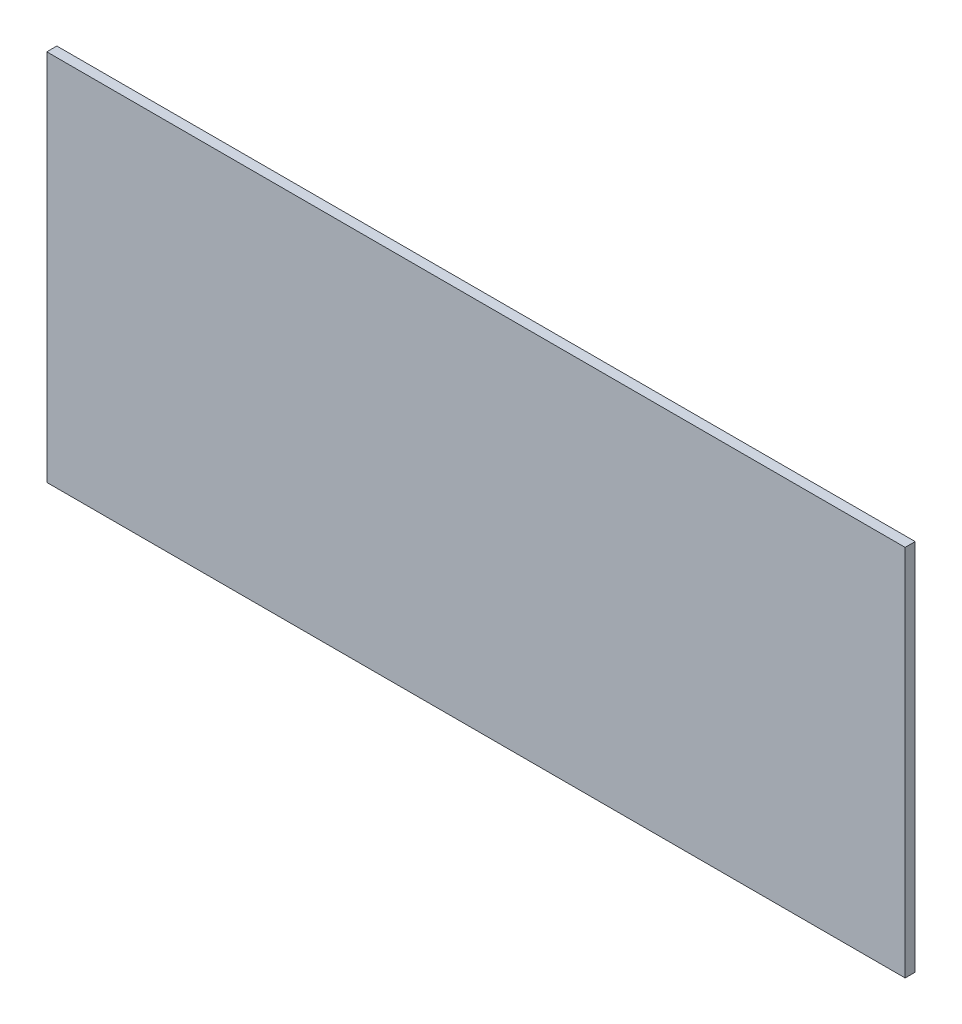
ISO-10303-21;
HEADER;
FILE_DESCRIPTION(('STEP AP214'),'2;1');
FILE_NAME('part.step','',(''),(''),'','','');
FILE_SCHEMA(('AUTOMOTIVE_DESIGN { 1 0 10303 214 1 1 1 1 }'));
ENDSEC;
DATA;
#1=APPLICATION_CONTEXT('core data for automotive mechanical design processes');
#2=APPLICATION_PROTOCOL_DEFINITION('international standard','automotive_design',2000,#1);
#3=PRODUCT_CONTEXT('',#1,'mechanical');
#4=PRODUCT('Part','Part','',(#3));
#5=PRODUCT_RELATED_PRODUCT_CATEGORY('part','',(#4));
#6=PRODUCT_DEFINITION_FORMATION('','',#4);
#7=PRODUCT_DEFINITION_CONTEXT('part definition',#1,'design');
#8=PRODUCT_DEFINITION('design','',#6,#7);
#9=PRODUCT_DEFINITION_SHAPE('','',#8);
#10=(LENGTH_UNIT() NAMED_UNIT(*) SI_UNIT(.MILLI.,.METRE.));
#11=(NAMED_UNIT(*) PLANE_ANGLE_UNIT() SI_UNIT($,.RADIAN.));
#12=(NAMED_UNIT(*) SI_UNIT($,.STERADIAN.) SOLID_ANGLE_UNIT());
#13=UNCERTAINTY_MEASURE_WITH_UNIT(LENGTH_MEASURE(1.E-05),#10,'distance_accuracy_value','');
#14=(GEOMETRIC_REPRESENTATION_CONTEXT(3) GLOBAL_UNCERTAINTY_ASSIGNED_CONTEXT((#13)) GLOBAL_UNIT_ASSIGNED_CONTEXT((#10,
#11,#12)) REPRESENTATION_CONTEXT('',''));
#15=CARTESIAN_POINT('',(0.,0.,0.));
#16=DIRECTION('',(0.,0.,1.));
#17=DIRECTION('',(1.,0.,0.));
#18=AXIS2_PLACEMENT_3D('',#15,#16,#17);
#19=CARTESIAN_POINT('',(-104.167101827676,3.,3.));
#20=DIRECTION('',(1.,0.,0.));
#21=DIRECTION('',(0.,0.,-1.));
#22=AXIS2_PLACEMENT_3D('',#19,#20,#21);
#23=PLANE('',#22);
#24=DIRECTION('',(0.,-1.,0.));
#25=VECTOR('',#24,1.);
#26=CARTESIAN_POINT('',(-104.167101827676,3.,0.));
#27=LINE('',#26,#25);
#28=CARTESIAN_POINT('',(-104.167101827676,3.,0.));
#29=VERTEX_POINT('',#28);
#30=CARTESIAN_POINT('',(-104.167101827676,-108.25,0.));
#31=VERTEX_POINT('',#30);
#32=EDGE_CURVE('E96',#29,#31,#27,.T.);
#33=ORIENTED_EDGE('',*,*,#32,.T.);
#34=DIRECTION('',(0.,0.,-1.));
#35=VECTOR('',#34,1.);
#36=CARTESIAN_POINT('',(-104.167101827676,-108.25,3.));
#37=LINE('',#36,#35);
#38=CARTESIAN_POINT('',(-104.167101827676,-108.25,3.));
#39=VERTEX_POINT('',#38);
#40=EDGE_CURVE('E11',#39,#31,#37,.T.);
#41=ORIENTED_EDGE('',*,*,#40,.F.);
#42=DIRECTION('',(0.,-1.,0.));
#43=VECTOR('',#42,1.);
#44=CARTESIAN_POINT('',(-104.167101827676,3.,3.));
#45=LINE('',#44,#43);
#46=CARTESIAN_POINT('',(-104.167101827676,3.,3.));
#47=VERTEX_POINT('',#46);
#48=EDGE_CURVE('E82',#47,#39,#45,.T.);
#49=ORIENTED_EDGE('',*,*,#48,.F.);
#50=DIRECTION('',(0.,0.,-1.));
#51=VECTOR('',#50,1.);
#52=CARTESIAN_POINT('',(-104.167101827676,3.,3.));
#53=LINE('',#52,#51);
#54=EDGE_CURVE('E49',#47,#29,#53,.T.);
#55=ORIENTED_EDGE('',*,*,#54,.T.);
#56=EDGE_LOOP('',(#33,#41,#49,#55));
#57=FACE_BOUND('',#56,.T.);
#58=ADVANCED_FACE('F33',(#57),#23,.F.);
#59=CARTESIAN_POINT('',(-104.167101827676,-108.25,3.));
#60=DIRECTION('',(0.,1.,0.));
#61=DIRECTION('',(0.,0.,1.));
#62=AXIS2_PLACEMENT_3D('',#59,#60,#61);
#63=PLANE('',#62);
#64=DIRECTION('',(1.,0.,0.));
#65=VECTOR('',#64,1.);
#66=CARTESIAN_POINT('',(-104.167101827676,-108.25,0.));
#67=LINE('',#66,#65);
#68=CARTESIAN_POINT('',(151.894045329306,-108.25,0.));
#69=VERTEX_POINT('',#68);
#70=EDGE_CURVE('E87',#31,#69,#67,.T.);
#71=ORIENTED_EDGE('',*,*,#70,.T.);
#72=DIRECTION('',(0.,0.,-1.));
#73=VECTOR('',#72,1.);
#74=CARTESIAN_POINT('',(151.894045329306,-108.25,3.));
#75=LINE('',#74,#73);
#76=CARTESIAN_POINT('',(151.894045329306,-108.25,3.));
#77=VERTEX_POINT('',#76);
#78=EDGE_CURVE('E41',#77,#69,#75,.T.);
#79=ORIENTED_EDGE('',*,*,#78,.F.);
#80=DIRECTION('',(1.,0.,0.));
#81=VECTOR('',#80,1.);
#82=CARTESIAN_POINT('',(-104.167101827676,-108.25,3.));
#83=LINE('',#82,#81);
#84=EDGE_CURVE('E74',#39,#77,#83,.T.);
#85=ORIENTED_EDGE('',*,*,#84,.F.);
#86=ORIENTED_EDGE('',*,*,#40,.T.);
#87=EDGE_LOOP('',(#71,#79,#85,#86));
#88=FACE_BOUND('',#87,.T.);
#89=ADVANCED_FACE('F86',(#88),#63,.F.);
#90=CARTESIAN_POINT('',(151.894045329306,3.,3.));
#91=DIRECTION('',(1.,0.,0.));
#92=DIRECTION('',(0.,0.,-1.));
#93=AXIS2_PLACEMENT_3D('',#90,#91,#92);
#94=PLANE('',#93);
#95=DIRECTION('',(0.,-1.,0.));
#96=VECTOR('',#95,1.);
#97=CARTESIAN_POINT('',(151.894045329306,3.,0.));
#98=LINE('',#97,#96);
#99=CARTESIAN_POINT('',(151.894045329306,3.,0.));
#100=VERTEX_POINT('',#99);
#101=EDGE_CURVE('E99',#100,#69,#98,.T.);
#102=ORIENTED_EDGE('',*,*,#101,.F.);
#103=DIRECTION('',(0.,0.,-1.));
#104=VECTOR('',#103,1.);
#105=CARTESIAN_POINT('',(151.894045329306,3.,3.));
#106=LINE('',#105,#104);
#107=CARTESIAN_POINT('',(151.894045329306,3.,3.));
#108=VERTEX_POINT('',#107);
#109=EDGE_CURVE('E63',#108,#100,#106,.T.);
#110=ORIENTED_EDGE('',*,*,#109,.F.);
#111=DIRECTION('',(0.,-1.,0.));
#112=VECTOR('',#111,1.);
#113=CARTESIAN_POINT('',(151.894045329306,3.,3.));
#114=LINE('',#113,#112);
#115=EDGE_CURVE('E81',#108,#77,#114,.T.);
#116=ORIENTED_EDGE('',*,*,#115,.T.);
#117=ORIENTED_EDGE('',*,*,#78,.T.);
#118=EDGE_LOOP('',(#102,#110,#116,#117));
#119=FACE_BOUND('',#118,.T.);
#120=ADVANCED_FACE('F90',(#119),#94,.T.);
#121=CARTESIAN_POINT('',(-104.167101827676,3.,3.));
#122=DIRECTION('',(0.,1.,0.));
#123=DIRECTION('',(0.,0.,1.));
#124=AXIS2_PLACEMENT_3D('',#121,#122,#123);
#125=PLANE('',#124);
#126=DIRECTION('',(1.,0.,0.));
#127=VECTOR('',#126,1.);
#128=CARTESIAN_POINT('',(-104.167101827676,3.,0.));
#129=LINE('',#128,#127);
#130=EDGE_CURVE('E101',#29,#100,#129,.T.);
#131=ORIENTED_EDGE('',*,*,#130,.F.);
#132=ORIENTED_EDGE('',*,*,#54,.F.);
#133=DIRECTION('',(1.,0.,0.));
#134=VECTOR('',#133,1.);
#135=CARTESIAN_POINT('',(-104.167101827676,3.,3.));
#136=LINE('',#135,#134);
#137=EDGE_CURVE('E91',#47,#108,#136,.T.);
#138=ORIENTED_EDGE('',*,*,#137,.T.);
#139=ORIENTED_EDGE('',*,*,#109,.T.);
#140=EDGE_LOOP('',(#131,#132,#138,#139));
#141=FACE_BOUND('',#140,.T.);
#142=ADVANCED_FACE('F107',(#141),#125,.T.);
#143=CARTESIAN_POINT('',(0.,0.,3.));
#144=DIRECTION('',(0.,0.,1.));
#145=DIRECTION('',(1.,0.,0.));
#146=AXIS2_PLACEMENT_3D('',#143,#144,#145);
#147=PLANE('',#146);
#148=ORIENTED_EDGE('',*,*,#48,.T.);
#149=ORIENTED_EDGE('',*,*,#84,.T.);
#150=ORIENTED_EDGE('',*,*,#115,.F.);
#151=ORIENTED_EDGE('',*,*,#137,.F.);
#152=EDGE_LOOP('',(#148,#149,#150,#151));
#153=FACE_BOUND('',#152,.T.);
#154=ADVANCED_FACE('F78',(#153),#147,.T.);
#155=CARTESIAN_POINT('',(0.,0.,0.));
#156=DIRECTION('',(0.,0.,1.));
#157=DIRECTION('',(1.,0.,0.));
#158=AXIS2_PLACEMENT_3D('',#155,#156,#157);
#159=PLANE('',#158);
#160=ORIENTED_EDGE('',*,*,#32,.F.);
#161=ORIENTED_EDGE('',*,*,#130,.T.);
#162=ORIENTED_EDGE('',*,*,#101,.T.);
#163=ORIENTED_EDGE('',*,*,#70,.F.);
#164=EDGE_LOOP('',(#160,#161,#162,#163));
#165=FACE_BOUND('',#164,.T.);
#166=ADVANCED_FACE('F106',(#165),#159,.F.);
#167=CLOSED_SHELL('',(#58,#89,#120,#142,#154,#166));
#168=MANIFOLD_SOLID_BREP('B2',#167);
#169=ADVANCED_BREP_SHAPE_REPRESENTATION('',(#18,#168),#14);
#170=SHAPE_DEFINITION_REPRESENTATION(#9,#169);
ENDSEC;
END-ISO-10303-21;
